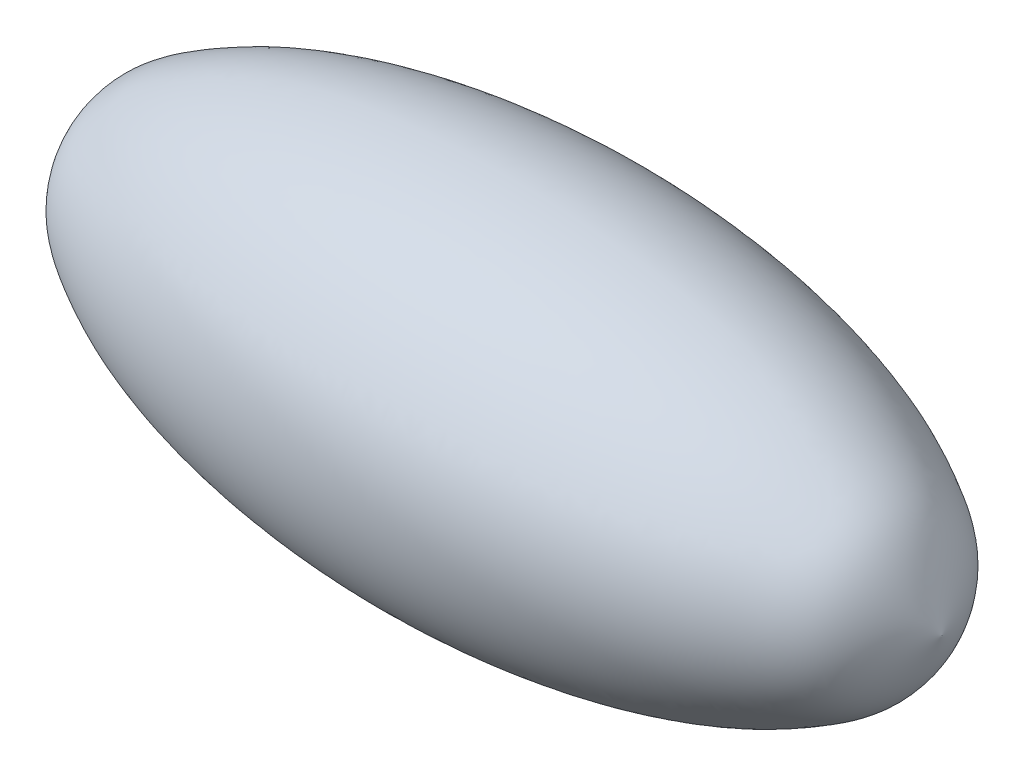
ISO-10303-21;
HEADER;
FILE_DESCRIPTION(('STEP AP214'),'2;1');
FILE_NAME('part.step','',(''),(''),'','','');
FILE_SCHEMA(('AUTOMOTIVE_DESIGN { 1 0 10303 214 1 1 1 1 }'));
ENDSEC;
DATA;
#1=APPLICATION_CONTEXT('core data for automotive mechanical design processes');
#2=APPLICATION_PROTOCOL_DEFINITION('international standard','automotive_design',2000,#1);
#3=PRODUCT_CONTEXT('',#1,'mechanical');
#4=PRODUCT('Part','Part','',(#3));
#5=PRODUCT_RELATED_PRODUCT_CATEGORY('part','',(#4));
#6=PRODUCT_DEFINITION_FORMATION('','',#4);
#7=PRODUCT_DEFINITION_CONTEXT('part definition',#1,'design');
#8=PRODUCT_DEFINITION('design','',#6,#7);
#9=PRODUCT_DEFINITION_SHAPE('','',#8);
#10=(LENGTH_UNIT() NAMED_UNIT(*) SI_UNIT(.MILLI.,.METRE.));
#11=(NAMED_UNIT(*) PLANE_ANGLE_UNIT() SI_UNIT($,.RADIAN.));
#12=(NAMED_UNIT(*) SI_UNIT($,.STERADIAN.) SOLID_ANGLE_UNIT());
#13=UNCERTAINTY_MEASURE_WITH_UNIT(LENGTH_MEASURE(1.E-05),#10,'distance_accuracy_value','');
#14=(GEOMETRIC_REPRESENTATION_CONTEXT(3) GLOBAL_UNCERTAINTY_ASSIGNED_CONTEXT((#13)) GLOBAL_UNIT_ASSIGNED_CONTEXT((#10,
#11,#12)) REPRESENTATION_CONTEXT('',''));
#15=CARTESIAN_POINT('',(0.,0.,0.));
#16=DIRECTION('',(0.,0.,1.));
#17=DIRECTION('',(1.,0.,0.));
#18=AXIS2_PLACEMENT_3D('',#15,#16,#17);
#19=CARTESIAN_POINT('',(0.,0.,0.));
#20=CARTESIAN_POINT('',(-3.34728760807037,8.83049174672856,0.));
#21=CARTESIAN_POINT('',(-8.63705775619277,22.7854538248196,0.));
#22=CARTESIAN_POINT('',(-25.5609998762051,33.0215736095755,0.));
#23=CARTESIAN_POINT('',(-38.692183286296,39.4341991765542,0.));
#24=CARTESIAN_POINT('',(-51.8523498148389,44.1237948844508,0.));
#25=CARTESIAN_POINT('',(-64.8994842203684,47.7493668098657,0.));
#26=CARTESIAN_POINT('',(-77.9365733841035,50.5149561525374,0.));
#27=CARTESIAN_POINT('',(-90.9583058600053,52.5666161858214,0.));
#28=CARTESIAN_POINT('',(-103.974926364924,53.9838858887368,0.));
#29=CARTESIAN_POINT('',(-116.988117971928,54.8167434728398,0.));
#30=CARTESIAN_POINT('',(-130.,55.09154413207,0.));
#31=CARTESIAN_POINT('',(-143.011882028072,54.8167434728398,0.));
#32=CARTESIAN_POINT('',(-156.025073635076,53.9838858887368,0.));
#33=CARTESIAN_POINT('',(-169.041694139995,52.5666161858215,0.));
#34=CARTESIAN_POINT('',(-182.063426615897,50.5149561525374,0.));
#35=CARTESIAN_POINT('',(-195.100515779632,47.7493668098658,0.));
#36=CARTESIAN_POINT('',(-208.147650185161,44.1237948844508,0.));
#37=CARTESIAN_POINT('',(-221.307816713704,39.4341991765542,0.));
#38=CARTESIAN_POINT('',(-234.439000123795,33.0215736095755,0.));
#39=CARTESIAN_POINT('',(-251.362942243807,22.7854538248196,0.));
#40=CARTESIAN_POINT('',(-256.65271239193,8.83049174672855,0.));
#41=CARTESIAN_POINT('',(-260.,0.,0.));
#42=B_SPLINE_CURVE_WITH_KNOTS('',3,(#19,#20,#21,#22,#23,#24,#25,#26,#27,#28,#29,#30,#31,#32,#33,
#34,#35,#36,#37,#38,#39,#40,#41),.UNSPECIFIED.,.F.,.F.,(4,1,1,1,1,1,1,1,1,1,1,1,1,1,1,1,1,1,1,1,
4),(0.,0.0906486460239755,0.143253451107467,0.191238799417706,0.237211897792108,
0.282076784868716,0.326262315991929,0.370011280436096,0.41347975066247,0.456779596040452,0.5,
0.543220403959548,0.58652024933753,0.629988719563904,0.673737684008071,0.717923215131284,
0.762788102207892,0.808761200582294,0.856746548892532,0.909351353976025,1.),.UNSPECIFIED.);
#43=CARTESIAN_POINT('',(10.,0.,0.));
#44=DIRECTION('',(1.,0.,0.));
#45=AXIS1_PLACEMENT('',#43,#44);
#46=SURFACE_OF_REVOLUTION('',#42,#45);
#47=CARTESIAN_POINT('',(-260.,0.,0.));
#48=VERTEX_POINT('',#47);
#49=VERTEX_LOOP('',#48);
#50=FACE_BOUND('',#49,.T.);
#51=CARTESIAN_POINT('',(0.,0.,0.));
#52=VERTEX_POINT('',#51);
#53=VERTEX_LOOP('',#52);
#54=FACE_BOUND('',#53,.T.);
#55=ADVANCED_FACE('F38',(#50,#54),#46,.F.);
#56=CLOSED_SHELL('',(#55));
#57=MANIFOLD_SOLID_BREP('B2',#56);
#58=ADVANCED_BREP_SHAPE_REPRESENTATION('',(#18,#57),#14);
#59=SHAPE_DEFINITION_REPRESENTATION(#9,#58);
ENDSEC;
END-ISO-10303-21;
